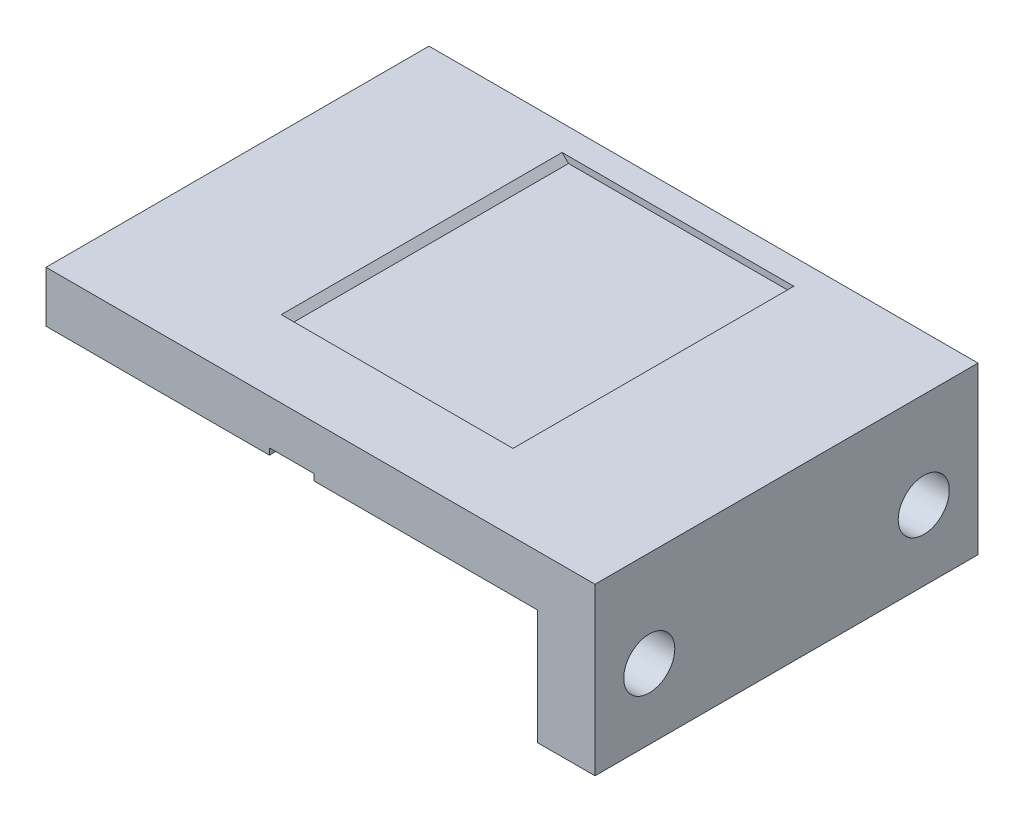
ISO-10303-21;
HEADER;
FILE_DESCRIPTION(('STEP AP214'),'2;1');
FILE_NAME('part.step','',(''),(''),'','','');
FILE_SCHEMA(('AUTOMOTIVE_DESIGN { 1 0 10303 214 1 1 1 1 }'));
ENDSEC;
DATA;
#1=APPLICATION_CONTEXT('core data for automotive mechanical design processes');
#2=APPLICATION_PROTOCOL_DEFINITION('international standard','automotive_design',2000,#1);
#3=PRODUCT_CONTEXT('',#1,'mechanical');
#4=PRODUCT('Part','Part','',(#3));
#5=PRODUCT_RELATED_PRODUCT_CATEGORY('part','',(#4));
#6=PRODUCT_DEFINITION_FORMATION('','',#4);
#7=PRODUCT_DEFINITION_CONTEXT('part definition',#1,'design');
#8=PRODUCT_DEFINITION('design','',#6,#7);
#9=PRODUCT_DEFINITION_SHAPE('','',#8);
#10=(LENGTH_UNIT() NAMED_UNIT(*) SI_UNIT(.MILLI.,.METRE.));
#11=(NAMED_UNIT(*) PLANE_ANGLE_UNIT() SI_UNIT($,.RADIAN.));
#12=(NAMED_UNIT(*) SI_UNIT($,.STERADIAN.) SOLID_ANGLE_UNIT());
#13=UNCERTAINTY_MEASURE_WITH_UNIT(LENGTH_MEASURE(1.E-05),#10,'distance_accuracy_value','');
#14=(GEOMETRIC_REPRESENTATION_CONTEXT(3) GLOBAL_UNCERTAINTY_ASSIGNED_CONTEXT((#13)) GLOBAL_UNIT_ASSIGNED_CONTEXT((#10,
#11,#12)) REPRESENTATION_CONTEXT('',''));
#15=CARTESIAN_POINT('',(0.,0.,0.));
#16=DIRECTION('',(0.,0.,1.));
#17=DIRECTION('',(1.,0.,0.));
#18=AXIS2_PLACEMENT_3D('',#15,#16,#17);
#19=CARTESIAN_POINT('',(0.,0.,0.));
#20=DIRECTION('',(0.,-1.,0.));
#21=DIRECTION('',(0.,0.,-1.));
#22=AXIS2_PLACEMENT_3D('',#19,#20,#21);
#23=PLANE('',#22);
#24=DIRECTION('',(0.,0.,1.));
#25=VECTOR('',#24,1.);
#26=CARTESIAN_POINT('',(42.,0.,-60.));
#27=LINE('',#26,#25);
#28=CARTESIAN_POINT('',(42.,0.,-60.));
#29=VERTEX_POINT('',#28);
#30=CARTESIAN_POINT('',(42.,0.,0.));
#31=VERTEX_POINT('',#30);
#32=EDGE_CURVE('E189',#29,#31,#27,.T.);
#33=ORIENTED_EDGE('',*,*,#32,.F.);
#34=DIRECTION('',(-1.,0.,0.));
#35=VECTOR('',#34,1.);
#36=CARTESIAN_POINT('',(0.,0.,-60.));
#37=LINE('',#36,#35);
#38=CARTESIAN_POINT('',(77.,0.,-60.));
#39=VERTEX_POINT('',#38);
#40=EDGE_CURVE('E88',#39,#29,#37,.T.);
#41=ORIENTED_EDGE('',*,*,#40,.F.);
#42=DIRECTION('',(0.,0.,-1.));
#43=VECTOR('',#42,1.);
#44=CARTESIAN_POINT('',(77.,0.,0.));
#45=LINE('',#44,#43);
#46=CARTESIAN_POINT('',(77.,0.,0.));
#47=VERTEX_POINT('',#46);
#48=EDGE_CURVE('E89',#47,#39,#45,.T.);
#49=ORIENTED_EDGE('',*,*,#48,.F.);
#50=DIRECTION('',(1.,0.,0.));
#51=VECTOR('',#50,1.);
#52=CARTESIAN_POINT('',(0.,0.,0.));
#53=LINE('',#52,#51);
#54=EDGE_CURVE('E100',#31,#47,#53,.T.);
#55=ORIENTED_EDGE('',*,*,#54,.F.);
#56=EDGE_LOOP('',(#33,#41,#49,#55));
#57=FACE_BOUND('',#56,.T.);
#58=ADVANCED_FACE('F34',(#57),#23,.T.);
#59=CARTESIAN_POINT('',(0.,8.,0.));
#60=DIRECTION('',(0.,-1.,0.));
#61=DIRECTION('',(0.,0.,-1.));
#62=AXIS2_PLACEMENT_3D('',#59,#60,#61);
#63=PLANE('',#62);
#64=DIRECTION('',(0.,0.,1.));
#65=VECTOR('',#64,1.);
#66=CARTESIAN_POINT('',(0.,8.,0.));
#67=LINE('',#66,#65);
#68=CARTESIAN_POINT('',(0.,8.,-60.));
#69=VERTEX_POINT('',#68);
#70=CARTESIAN_POINT('',(0.,8.,0.));
#71=VERTEX_POINT('',#70);
#72=EDGE_CURVE('E95',#69,#71,#67,.T.);
#73=ORIENTED_EDGE('',*,*,#72,.T.);
#74=DIRECTION('',(1.,0.,0.));
#75=VECTOR('',#74,1.);
#76=CARTESIAN_POINT('',(0.,8.,0.));
#77=LINE('',#76,#75);
#78=CARTESIAN_POINT('',(86.,8.,0.));
#79=VERTEX_POINT('',#78);
#80=EDGE_CURVE('E151',#71,#79,#77,.T.);
#81=ORIENTED_EDGE('',*,*,#80,.T.);
#82=DIRECTION('',(0.,0.,-1.));
#83=VECTOR('',#82,1.);
#84=CARTESIAN_POINT('',(86.,8.,0.));
#85=LINE('',#84,#83);
#86=CARTESIAN_POINT('',(86.,8.,-60.));
#87=VERTEX_POINT('',#86);
#88=EDGE_CURVE('E130',#79,#87,#85,.T.);
#89=ORIENTED_EDGE('',*,*,#88,.T.);
#90=DIRECTION('',(-1.,0.,0.));
#91=VECTOR('',#90,1.);
#92=CARTESIAN_POINT('',(0.,8.,-60.));
#93=LINE('',#92,#91);
#94=EDGE_CURVE('E60',#87,#69,#93,.T.);
#95=ORIENTED_EDGE('',*,*,#94,.T.);
#96=EDGE_LOOP('',(#73,#81,#89,#95));
#97=FACE_BOUND('',#96,.T.);
#98=DIRECTION('',(0.,0.,-1.));
#99=VECTOR('',#98,1.);
#100=CARTESIAN_POINT('',(24.85,8.,-10.5857864376269));
#101=LINE('',#100,#99);
#102=CARTESIAN_POINT('',(24.85,8.,-12.));
#103=VERTEX_POINT('',#102);
#104=CARTESIAN_POINT('',(24.85,8.,-56.));
#105=VERTEX_POINT('',#104);
#106=EDGE_CURVE('E413',#103,#105,#101,.T.);
#107=ORIENTED_EDGE('',*,*,#106,.T.);
#108=DIRECTION('',(1.,0.,0.));
#109=VECTOR('',#108,1.);
#110=CARTESIAN_POINT('',(25.85,8.,-56.));
#111=LINE('',#110,#109);
#112=CARTESIAN_POINT('',(61.15,8.,-56.));
#113=VERTEX_POINT('',#112);
#114=EDGE_CURVE('E416',#105,#113,#111,.T.);
#115=ORIENTED_EDGE('',*,*,#114,.T.);
#116=DIRECTION('',(0.,0.,-1.));
#117=VECTOR('',#116,1.);
#118=CARTESIAN_POINT('',(61.15,8.,-10.5857864376269));
#119=LINE('',#118,#117);
#120=CARTESIAN_POINT('',(61.15,8.,-12.));
#121=VERTEX_POINT('',#120);
#122=EDGE_CURVE('E405',#121,#113,#119,.T.);
#123=ORIENTED_EDGE('',*,*,#122,.F.);
#124=DIRECTION('',(1.,0.,0.));
#125=VECTOR('',#124,1.);
#126=CARTESIAN_POINT('',(25.85,8.,-12.));
#127=LINE('',#126,#125);
#128=EDGE_CURVE('E127',#103,#121,#127,.T.);
#129=ORIENTED_EDGE('',*,*,#128,.F.);
#130=EDGE_LOOP('',(#107,#115,#123,#129));
#131=FACE_BOUND('',#130,.T.);
#132=ADVANCED_FACE('F155',(#97,#131),#63,.F.);
#133=CARTESIAN_POINT('',(0.,8.,0.));
#134=DIRECTION('',(1.,0.,0.));
#135=DIRECTION('',(0.,0.,-1.));
#136=AXIS2_PLACEMENT_3D('',#133,#134,#135);
#137=PLANE('',#136);
#138=DIRECTION('',(0.,0.,1.));
#139=VECTOR('',#138,1.);
#140=CARTESIAN_POINT('',(0.,0.,0.));
#141=LINE('',#140,#139);
#142=CARTESIAN_POINT('',(0.,0.,-60.));
#143=VERTEX_POINT('',#142);
#144=CARTESIAN_POINT('',(0.,0.,0.));
#145=VERTEX_POINT('',#144);
#146=EDGE_CURVE('E94',#143,#145,#141,.T.);
#147=ORIENTED_EDGE('',*,*,#146,.T.);
#148=DIRECTION('',(0.,-1.,0.));
#149=VECTOR('',#148,1.);
#150=CARTESIAN_POINT('',(0.,8.,0.));
#151=LINE('',#150,#149);
#152=EDGE_CURVE('E11',#71,#145,#151,.T.);
#153=ORIENTED_EDGE('',*,*,#152,.F.);
#154=ORIENTED_EDGE('',*,*,#72,.F.);
#155=DIRECTION('',(0.,-1.,0.));
#156=VECTOR('',#155,1.);
#157=CARTESIAN_POINT('',(0.,8.,-60.));
#158=LINE('',#157,#156);
#159=EDGE_CURVE('E43',#69,#143,#158,.T.);
#160=ORIENTED_EDGE('',*,*,#159,.T.);
#161=EDGE_LOOP('',(#147,#153,#154,#160));
#162=FACE_BOUND('',#161,.T.);
#163=ADVANCED_FACE('F36',(#162),#137,.F.);
#164=CARTESIAN_POINT('',(0.,8.,0.));
#165=DIRECTION('',(0.,0.,-1.));
#166=DIRECTION('',(-1.,0.,0.));
#167=AXIS2_PLACEMENT_3D('',#164,#165,#166);
#168=PLANE('',#167);
#169=DIRECTION('',(-1.,0.,0.));
#170=VECTOR('',#169,1.);
#171=CARTESIAN_POINT('',(42.,1.,0.));
#172=LINE('',#171,#170);
#173=CARTESIAN_POINT('',(42.,1.,0.));
#174=VERTEX_POINT('',#173);
#175=CARTESIAN_POINT('',(35.,1.,0.));
#176=VERTEX_POINT('',#175);
#177=EDGE_CURVE('E386',#174,#176,#172,.T.);
#178=ORIENTED_EDGE('',*,*,#177,.F.);
#179=DIRECTION('',(0.,-1.,0.));
#180=VECTOR('',#179,1.);
#181=CARTESIAN_POINT('',(42.,1.,0.));
#182=LINE('',#181,#180);
#183=EDGE_CURVE('E395',#174,#31,#182,.T.);
#184=ORIENTED_EDGE('',*,*,#183,.T.);
#185=ORIENTED_EDGE('',*,*,#54,.T.);
#186=DIRECTION('',(0.,-1.,0.));
#187=VECTOR('',#186,1.);
#188=CARTESIAN_POINT('',(77.,8.,0.));
#189=LINE('',#188,#187);
#190=CARTESIAN_POINT('',(77.,-18.,0.));
#191=VERTEX_POINT('',#190);
#192=EDGE_CURVE('E133',#47,#191,#189,.T.);
#193=ORIENTED_EDGE('',*,*,#192,.T.);
#194=DIRECTION('',(-1.,0.,0.));
#195=VECTOR('',#194,1.);
#196=CARTESIAN_POINT('',(86.,-18.,0.));
#197=LINE('',#196,#195);
#198=CARTESIAN_POINT('',(86.,-18.,0.));
#199=VERTEX_POINT('',#198);
#200=EDGE_CURVE('E101',#199,#191,#197,.T.);
#201=ORIENTED_EDGE('',*,*,#200,.F.);
#202=DIRECTION('',(0.,-1.,0.));
#203=VECTOR('',#202,1.);
#204=CARTESIAN_POINT('',(86.,8.,0.));
#205=LINE('',#204,#203);
#206=EDGE_CURVE('E139',#79,#199,#205,.T.);
#207=ORIENTED_EDGE('',*,*,#206,.F.);
#208=ORIENTED_EDGE('',*,*,#80,.F.);
#209=ORIENTED_EDGE('',*,*,#152,.T.);
#210=CARTESIAN_POINT('',(35.,0.,0.));
#211=VERTEX_POINT('',#210);
#212=EDGE_CURVE('E99',#145,#211,#53,.T.);
#213=ORIENTED_EDGE('',*,*,#212,.T.);
#214=DIRECTION('',(0.,-1.,0.));
#215=VECTOR('',#214,1.);
#216=CARTESIAN_POINT('',(35.,1.,0.));
#217=LINE('',#216,#215);
#218=EDGE_CURVE('E51',#176,#211,#217,.T.);
#219=ORIENTED_EDGE('',*,*,#218,.F.);
#220=EDGE_LOOP('',(#178,#184,#185,#193,#201,#207,#208,#209,#213,#219));
#221=FACE_BOUND('',#220,.T.);
#222=ADVANCED_FACE('F164',(#221),#168,.F.);
#223=CARTESIAN_POINT('',(0.,8.,-60.));
#224=DIRECTION('',(0.,0.,1.));
#225=DIRECTION('',(1.,0.,0.));
#226=AXIS2_PLACEMENT_3D('',#223,#224,#225);
#227=PLANE('',#226);
#228=ORIENTED_EDGE('',*,*,#40,.T.);
#229=DIRECTION('',(0.,-1.,0.));
#230=VECTOR('',#229,1.);
#231=CARTESIAN_POINT('',(42.,1.,-60.));
#232=LINE('',#231,#230);
#233=CARTESIAN_POINT('',(42.,1.,-60.));
#234=VERTEX_POINT('',#233);
#235=EDGE_CURVE('E403',#234,#29,#232,.T.);
#236=ORIENTED_EDGE('',*,*,#235,.F.);
#237=DIRECTION('',(1.,0.,0.));
#238=VECTOR('',#237,1.);
#239=CARTESIAN_POINT('',(42.,1.,-60.));
#240=LINE('',#239,#238);
#241=CARTESIAN_POINT('',(35.,1.,-60.));
#242=VERTEX_POINT('',#241);
#243=EDGE_CURVE('E388',#242,#234,#240,.T.);
#244=ORIENTED_EDGE('',*,*,#243,.F.);
#245=DIRECTION('',(0.,-1.,0.));
#246=VECTOR('',#245,1.);
#247=CARTESIAN_POINT('',(35.,1.,-60.));
#248=LINE('',#247,#246);
#249=CARTESIAN_POINT('',(35.,0.,-60.));
#250=VERTEX_POINT('',#249);
#251=EDGE_CURVE('E85',#242,#250,#248,.T.);
#252=ORIENTED_EDGE('',*,*,#251,.T.);
#253=EDGE_CURVE('E77',#250,#143,#37,.T.);
#254=ORIENTED_EDGE('',*,*,#253,.T.);
#255=ORIENTED_EDGE('',*,*,#159,.F.);
#256=ORIENTED_EDGE('',*,*,#94,.F.);
#257=DIRECTION('',(0.,-1.,0.));
#258=VECTOR('',#257,1.);
#259=CARTESIAN_POINT('',(86.,8.,-60.));
#260=LINE('',#259,#258);
#261=CARTESIAN_POINT('',(86.,-18.,-60.));
#262=VERTEX_POINT('',#261);
#263=EDGE_CURVE('E132',#87,#262,#260,.T.);
#264=ORIENTED_EDGE('',*,*,#263,.T.);
#265=DIRECTION('',(-1.,0.,0.));
#266=VECTOR('',#265,1.);
#267=CARTESIAN_POINT('',(86.,-18.,-60.));
#268=LINE('',#267,#266);
#269=CARTESIAN_POINT('',(77.,-18.,-60.));
#270=VERTEX_POINT('',#269);
#271=EDGE_CURVE('E105',#262,#270,#268,.T.);
#272=ORIENTED_EDGE('',*,*,#271,.T.);
#273=DIRECTION('',(0.,-1.,0.));
#274=VECTOR('',#273,1.);
#275=CARTESIAN_POINT('',(77.,8.,-60.));
#276=LINE('',#275,#274);
#277=EDGE_CURVE('E117',#39,#270,#276,.T.);
#278=ORIENTED_EDGE('',*,*,#277,.F.);
#279=EDGE_LOOP('',(#228,#236,#244,#252,#254,#255,#256,#264,#272,#278));
#280=FACE_BOUND('',#279,.T.);
#281=ADVANCED_FACE('F80',(#280),#227,.F.);
#282=DIRECTION('',(0.,0.,-1.));
#283=VECTOR('',#282,1.);
#284=CARTESIAN_POINT('',(35.,0.,-60.));
#285=LINE('',#284,#283);
#286=EDGE_CURVE('E392',#211,#250,#285,.T.);
#287=ORIENTED_EDGE('',*,*,#286,.F.);
#288=ORIENTED_EDGE('',*,*,#212,.F.);
#289=ORIENTED_EDGE('',*,*,#146,.F.);
#290=ORIENTED_EDGE('',*,*,#253,.F.);
#291=EDGE_LOOP('',(#287,#288,#289,#290));
#292=FACE_BOUND('',#291,.T.);
#293=ADVANCED_FACE('F97',(#292),#23,.T.);
#294=CARTESIAN_POINT('',(86.,-18.,0.));
#295=DIRECTION('',(0.,1.,0.));
#296=DIRECTION('',(0.,0.,1.));
#297=AXIS2_PLACEMENT_3D('',#294,#295,#296);
#298=PLANE('',#297);
#299=DIRECTION('',(0.,0.,-1.));
#300=VECTOR('',#299,1.);
#301=CARTESIAN_POINT('',(77.,-18.,0.));
#302=LINE('',#301,#300);
#303=EDGE_CURVE('E144',#191,#270,#302,.T.);
#304=ORIENTED_EDGE('',*,*,#303,.T.);
#305=ORIENTED_EDGE('',*,*,#271,.F.);
#306=DIRECTION('',(0.,0.,-1.));
#307=VECTOR('',#306,1.);
#308=CARTESIAN_POINT('',(86.,-18.,0.));
#309=LINE('',#308,#307);
#310=EDGE_CURVE('E136',#199,#262,#309,.T.);
#311=ORIENTED_EDGE('',*,*,#310,.F.);
#312=ORIENTED_EDGE('',*,*,#200,.T.);
#313=EDGE_LOOP('',(#304,#305,#311,#312));
#314=FACE_BOUND('',#313,.T.);
#315=ADVANCED_FACE('F196',(#314),#298,.F.);
#316=CARTESIAN_POINT('',(86.,0.,0.));
#317=DIRECTION('',(-1.,0.,0.));
#318=DIRECTION('',(0.,0.,1.));
#319=AXIS2_PLACEMENT_3D('',#316,#317,#318);
#320=PLANE('',#319);
#321=CARTESIAN_POINT('',(86.,-7.,-8.5));
#322=DIRECTION('',(1.,0.,0.));
#323=DIRECTION('',(0.,0.,-1.));
#324=AXIS2_PLACEMENT_3D('',#321,#322,#323);
#325=CIRCLE('',#324,4.);
#326=CARTESIAN_POINT('',(86.,-7.,-12.5));
#327=VERTEX_POINT('',#326);
#328=EDGE_CURVE('E113',#327,#327,#325,.T.);
#329=ORIENTED_EDGE('',*,*,#328,.F.);
#330=EDGE_LOOP('',(#329));
#331=FACE_BOUND('',#330,.T.);
#332=CARTESIAN_POINT('',(86.,-6.99999999999999,-51.5));
#333=DIRECTION('',(1.,0.,0.));
#334=DIRECTION('',(0.,0.,1.));
#335=AXIS2_PLACEMENT_3D('',#332,#333,#334);
#336=CIRCLE('',#335,4.00000000000001);
#337=CARTESIAN_POINT('',(86.,-6.99999999999999,-47.5));
#338=VERTEX_POINT('',#337);
#339=EDGE_CURVE('E119',#338,#338,#336,.T.);
#340=ORIENTED_EDGE('',*,*,#339,.F.);
#341=EDGE_LOOP('',(#340));
#342=FACE_BOUND('',#341,.T.);
#343=ORIENTED_EDGE('',*,*,#88,.F.);
#344=ORIENTED_EDGE('',*,*,#206,.T.);
#345=ORIENTED_EDGE('',*,*,#310,.T.);
#346=ORIENTED_EDGE('',*,*,#263,.F.);
#347=EDGE_LOOP('',(#343,#344,#345,#346));
#348=FACE_BOUND('',#347,.T.);
#349=ADVANCED_FACE('F168',(#331,#342,#348),#320,.F.);
#350=CARTESIAN_POINT('',(77.,0.,0.));
#351=DIRECTION('',(-1.,0.,0.));
#352=DIRECTION('',(0.,0.,1.));
#353=AXIS2_PLACEMENT_3D('',#350,#351,#352);
#354=PLANE('',#353);
#355=CARTESIAN_POINT('',(77.,-7.,-8.5));
#356=DIRECTION('',(-1.,0.,0.));
#357=DIRECTION('',(0.,0.,1.));
#358=AXIS2_PLACEMENT_3D('',#355,#356,#357);
#359=CIRCLE('',#358,4.);
#360=CARTESIAN_POINT('',(77.,-7.,-4.5));
#361=VERTEX_POINT('',#360);
#362=EDGE_CURVE('E38',#361,#361,#359,.T.);
#363=ORIENTED_EDGE('',*,*,#362,.F.);
#364=EDGE_LOOP('',(#363));
#365=FACE_BOUND('',#364,.T.);
#366=CARTESIAN_POINT('',(77.,-6.99999999999999,-51.5));
#367=DIRECTION('',(-1.,0.,0.));
#368=DIRECTION('',(0.,0.,1.));
#369=AXIS2_PLACEMENT_3D('',#366,#367,#368);
#370=CIRCLE('',#369,4.00000000000001);
#371=CARTESIAN_POINT('',(77.,-6.99999999999999,-47.5));
#372=VERTEX_POINT('',#371);
#373=EDGE_CURVE('E111',#372,#372,#370,.T.);
#374=ORIENTED_EDGE('',*,*,#373,.F.);
#375=EDGE_LOOP('',(#374));
#376=FACE_BOUND('',#375,.T.);
#377=ORIENTED_EDGE('',*,*,#192,.F.);
#378=ORIENTED_EDGE('',*,*,#48,.T.);
#379=ORIENTED_EDGE('',*,*,#277,.T.);
#380=ORIENTED_EDGE('',*,*,#303,.F.);
#381=EDGE_LOOP('',(#377,#378,#379,#380));
#382=FACE_BOUND('',#381,.T.);
#383=ADVANCED_FACE('F192',(#365,#376,#382),#354,.T.);
#384=CARTESIAN_POINT('',(0.,-6.99999999999999,-51.5));
#385=DIRECTION('',(1.,0.,0.));
#386=DIRECTION('',(0.,0.,-1.));
#387=AXIS2_PLACEMENT_3D('',#384,#385,#386);
#388=CYLINDRICAL_SURFACE('',#387,4.00000000000001);
#389=ORIENTED_EDGE('',*,*,#373,.T.);
#390=EDGE_LOOP('',(#389));
#391=FACE_BOUND('',#390,.T.);
#392=ORIENTED_EDGE('',*,*,#339,.T.);
#393=EDGE_LOOP('',(#392));
#394=FACE_BOUND('',#393,.T.);
#395=ADVANCED_FACE('F342',(#391,#394),#388,.F.);
#396=CARTESIAN_POINT('',(0.,-7.,-8.5));
#397=DIRECTION('',(1.,0.,0.));
#398=DIRECTION('',(0.,0.,-1.));
#399=AXIS2_PLACEMENT_3D('',#396,#397,#398);
#400=CYLINDRICAL_SURFACE('',#399,4.);
#401=ORIENTED_EDGE('',*,*,#362,.T.);
#402=EDGE_LOOP('',(#401));
#403=FACE_BOUND('',#402,.T.);
#404=ORIENTED_EDGE('',*,*,#328,.T.);
#405=EDGE_LOOP('',(#404));
#406=FACE_BOUND('',#405,.T.);
#407=ADVANCED_FACE('F232',(#403,#406),#400,.F.);
#408=CARTESIAN_POINT('',(25.85,7.,-56.));
#409=DIRECTION('',(0.,0.,1.));
#410=DIRECTION('',(1.,0.,0.));
#411=AXIS2_PLACEMENT_3D('',#408,#409,#410);
#412=PLANE('',#411);
#413=ORIENTED_EDGE('',*,*,#114,.F.);
#414=DIRECTION('',(0.707106781186549,-0.707106781186546,0.));
#415=VECTOR('',#414,1.);
#416=CARTESIAN_POINT('',(25.85,7.,-56.));
#417=LINE('',#416,#415);
#418=CARTESIAN_POINT('',(25.85,7.,-56.));
#419=VERTEX_POINT('',#418);
#420=EDGE_CURVE('E409',#105,#419,#417,.T.);
#421=ORIENTED_EDGE('',*,*,#420,.T.);
#422=DIRECTION('',(1.,0.,0.));
#423=VECTOR('',#422,1.);
#424=CARTESIAN_POINT('',(25.85,7.,-56.));
#425=LINE('',#424,#423);
#426=CARTESIAN_POINT('',(60.15,7.,-56.));
#427=VERTEX_POINT('',#426);
#428=EDGE_CURVE('E430',#419,#427,#425,.T.);
#429=ORIENTED_EDGE('',*,*,#428,.T.);
#430=DIRECTION('',(0.707106781186548,0.707106781186547,0.));
#431=VECTOR('',#430,1.);
#432=CARTESIAN_POINT('',(60.15,7.,-56.));
#433=LINE('',#432,#431);
#434=EDGE_CURVE('E420',#427,#113,#433,.T.);
#435=ORIENTED_EDGE('',*,*,#434,.T.);
#436=EDGE_LOOP('',(#413,#421,#429,#435));
#437=FACE_BOUND('',#436,.T.);
#438=ADVANCED_FACE('F237',(#437),#412,.T.);
#439=CARTESIAN_POINT('',(25.85,7.,-12.));
#440=DIRECTION('',(0.,0.,1.));
#441=DIRECTION('',(1.,0.,0.));
#442=AXIS2_PLACEMENT_3D('',#439,#440,#441);
#443=PLANE('',#442);
#444=ORIENTED_EDGE('',*,*,#128,.T.);
#445=DIRECTION('',(0.707106781186548,0.707106781186547,0.));
#446=VECTOR('',#445,1.);
#447=CARTESIAN_POINT('',(60.15,7.,-12.));
#448=LINE('',#447,#446);
#449=CARTESIAN_POINT('',(60.15,7.,-12.));
#450=VERTEX_POINT('',#449);
#451=EDGE_CURVE('E419',#450,#121,#448,.T.);
#452=ORIENTED_EDGE('',*,*,#451,.F.);
#453=DIRECTION('',(1.,0.,0.));
#454=VECTOR('',#453,1.);
#455=CARTESIAN_POINT('',(25.85,7.,-12.));
#456=LINE('',#455,#454);
#457=CARTESIAN_POINT('',(25.85,7.,-12.));
#458=VERTEX_POINT('',#457);
#459=EDGE_CURVE('E124',#458,#450,#456,.T.);
#460=ORIENTED_EDGE('',*,*,#459,.F.);
#461=DIRECTION('',(0.707106781186549,-0.707106781186546,0.));
#462=VECTOR('',#461,1.);
#463=CARTESIAN_POINT('',(25.85,7.,-12.));
#464=LINE('',#463,#462);
#465=EDGE_CURVE('E412',#103,#458,#464,.T.);
#466=ORIENTED_EDGE('',*,*,#465,.F.);
#467=EDGE_LOOP('',(#444,#452,#460,#466));
#468=FACE_BOUND('',#467,.T.);
#469=ADVANCED_FACE('F241',(#468),#443,.F.);
#470=CARTESIAN_POINT('',(0.,7.,0.));
#471=DIRECTION('',(0.,-1.,0.));
#472=DIRECTION('',(0.,0.,-1.));
#473=AXIS2_PLACEMENT_3D('',#470,#471,#472);
#474=PLANE('',#473);
#475=DIRECTION('',(0.,0.,-1.));
#476=VECTOR('',#475,1.);
#477=CARTESIAN_POINT('',(25.85,7.,-12.));
#478=LINE('',#477,#476);
#479=EDGE_CURVE('E427',#458,#419,#478,.T.);
#480=ORIENTED_EDGE('',*,*,#479,.F.);
#481=ORIENTED_EDGE('',*,*,#459,.T.);
#482=DIRECTION('',(0.,0.,-1.));
#483=VECTOR('',#482,1.);
#484=CARTESIAN_POINT('',(60.15,7.,-12.));
#485=LINE('',#484,#483);
#486=EDGE_CURVE('E433',#450,#427,#485,.T.);
#487=ORIENTED_EDGE('',*,*,#486,.T.);
#488=ORIENTED_EDGE('',*,*,#428,.F.);
#489=EDGE_LOOP('',(#480,#481,#487,#488));
#490=FACE_BOUND('',#489,.T.);
#491=ADVANCED_FACE('F252',(#490),#474,.F.);
#492=CARTESIAN_POINT('',(60.15,7.,-10.5857864376269));
#493=DIRECTION('',(-0.707106781186547,0.707106781186548,0.));
#494=DIRECTION('',(-0.707106781186548,-0.707106781186547,0.));
#495=AXIS2_PLACEMENT_3D('',#492,#493,#494);
#496=PLANE('',#495);
#497=ORIENTED_EDGE('',*,*,#451,.T.);
#498=ORIENTED_EDGE('',*,*,#122,.T.);
#499=ORIENTED_EDGE('',*,*,#434,.F.);
#500=ORIENTED_EDGE('',*,*,#486,.F.);
#501=EDGE_LOOP('',(#497,#498,#499,#500));
#502=FACE_BOUND('',#501,.T.);
#503=ADVANCED_FACE('F264',(#502),#496,.T.);
#504=CARTESIAN_POINT('',(25.85,7.,-10.5857864376269));
#505=DIRECTION('',(0.707106781186546,0.707106781186549,0.));
#506=DIRECTION('',(-0.707106781186549,0.707106781186546,0.));
#507=AXIS2_PLACEMENT_3D('',#504,#505,#506);
#508=PLANE('',#507);
#509=ORIENTED_EDGE('',*,*,#465,.T.);
#510=ORIENTED_EDGE('',*,*,#479,.T.);
#511=ORIENTED_EDGE('',*,*,#420,.F.);
#512=ORIENTED_EDGE('',*,*,#106,.F.);
#513=EDGE_LOOP('',(#509,#510,#511,#512));
#514=FACE_BOUND('',#513,.T.);
#515=ADVANCED_FACE('F273',(#514),#508,.T.);
#516=CARTESIAN_POINT('',(42.,1.,-60.));
#517=DIRECTION('',(1.,0.,0.));
#518=DIRECTION('',(0.,0.,-1.));
#519=AXIS2_PLACEMENT_3D('',#516,#517,#518);
#520=PLANE('',#519);
#521=ORIENTED_EDGE('',*,*,#32,.T.);
#522=ORIENTED_EDGE('',*,*,#183,.F.);
#523=DIRECTION('',(0.,0.,1.));
#524=VECTOR('',#523,1.);
#525=CARTESIAN_POINT('',(42.,1.,-60.));
#526=LINE('',#525,#524);
#527=EDGE_CURVE('E383',#234,#174,#526,.T.);
#528=ORIENTED_EDGE('',*,*,#527,.F.);
#529=ORIENTED_EDGE('',*,*,#235,.T.);
#530=EDGE_LOOP('',(#521,#522,#528,#529));
#531=FACE_BOUND('',#530,.T.);
#532=ADVANCED_FACE('F282',(#531),#520,.F.);
#533=CARTESIAN_POINT('',(35.,1.,-60.));
#534=DIRECTION('',(-1.,0.,0.));
#535=DIRECTION('',(0.,0.,1.));
#536=AXIS2_PLACEMENT_3D('',#533,#534,#535);
#537=PLANE('',#536);
#538=ORIENTED_EDGE('',*,*,#286,.T.);
#539=ORIENTED_EDGE('',*,*,#251,.F.);
#540=DIRECTION('',(0.,0.,-1.));
#541=VECTOR('',#540,1.);
#542=CARTESIAN_POINT('',(35.,1.,-60.));
#543=LINE('',#542,#541);
#544=EDGE_CURVE('E396',#176,#242,#543,.T.);
#545=ORIENTED_EDGE('',*,*,#544,.F.);
#546=ORIENTED_EDGE('',*,*,#218,.T.);
#547=EDGE_LOOP('',(#538,#539,#545,#546));
#548=FACE_BOUND('',#547,.T.);
#549=ADVANCED_FACE('F316',(#548),#537,.F.);
#550=CARTESIAN_POINT('',(0.,1.,0.));
#551=DIRECTION('',(0.,-1.,0.));
#552=DIRECTION('',(0.,0.,-1.));
#553=AXIS2_PLACEMENT_3D('',#550,#551,#552);
#554=PLANE('',#553);
#555=ORIENTED_EDGE('',*,*,#527,.T.);
#556=ORIENTED_EDGE('',*,*,#177,.T.);
#557=ORIENTED_EDGE('',*,*,#544,.T.);
#558=ORIENTED_EDGE('',*,*,#243,.T.);
#559=EDGE_LOOP('',(#555,#556,#557,#558));
#560=FACE_BOUND('',#559,.T.);
#561=ADVANCED_FACE('F326',(#560),#554,.T.);
#562=CLOSED_SHELL('',(#58,#132,#163,#222,#281,#293,#315,#349,#383,#395,#407,#438,#469,#491,#503,
#515,#532,#549,#561));
#563=MANIFOLD_SOLID_BREP('B2',#562);
#564=ADVANCED_BREP_SHAPE_REPRESENTATION('',(#18,#563),#14);
#565=SHAPE_DEFINITION_REPRESENTATION(#9,#564);
ENDSEC;
END-ISO-10303-21;
